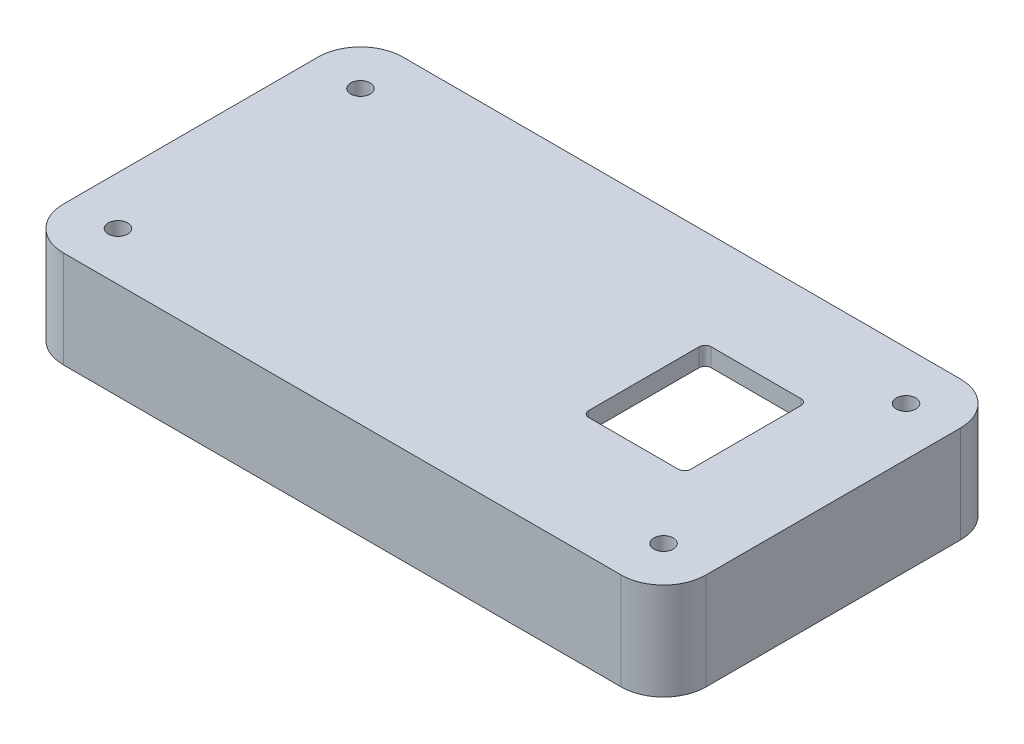
ISO-10303-21;
HEADER;
FILE_DESCRIPTION(('STEP AP214'),'2;1');
FILE_NAME('part.step','',(''),(''),'','','');
FILE_SCHEMA(('AUTOMOTIVE_DESIGN { 1 0 10303 214 1 1 1 1 }'));
ENDSEC;
DATA;
#1=APPLICATION_CONTEXT('core data for automotive mechanical design processes');
#2=APPLICATION_PROTOCOL_DEFINITION('international standard','automotive_design',2000,#1);
#3=PRODUCT_CONTEXT('',#1,'mechanical');
#4=PRODUCT('Part','Part','',(#3));
#5=PRODUCT_RELATED_PRODUCT_CATEGORY('part','',(#4));
#6=PRODUCT_DEFINITION_FORMATION('','',#4);
#7=PRODUCT_DEFINITION_CONTEXT('part definition',#1,'design');
#8=PRODUCT_DEFINITION('design','',#6,#7);
#9=PRODUCT_DEFINITION_SHAPE('','',#8);
#10=(LENGTH_UNIT() NAMED_UNIT(*) SI_UNIT(.MILLI.,.METRE.));
#11=(NAMED_UNIT(*) PLANE_ANGLE_UNIT() SI_UNIT($,.RADIAN.));
#12=(NAMED_UNIT(*) SI_UNIT($,.STERADIAN.) SOLID_ANGLE_UNIT());
#13=UNCERTAINTY_MEASURE_WITH_UNIT(LENGTH_MEASURE(1.E-05),#10,'distance_accuracy_value','');
#14=(GEOMETRIC_REPRESENTATION_CONTEXT(3) GLOBAL_UNCERTAINTY_ASSIGNED_CONTEXT((#13)) GLOBAL_UNIT_ASSIGNED_CONTEXT((#10,
#11,#12)) REPRESENTATION_CONTEXT('',''));
#15=CARTESIAN_POINT('',(0.,0.,0.));
#16=DIRECTION('',(0.,0.,1.));
#17=DIRECTION('',(1.,0.,0.));
#18=AXIS2_PLACEMENT_3D('',#15,#16,#17);
#19=CARTESIAN_POINT('',(0.,3.,0.));
#20=DIRECTION('',(0.,-1.,0.));
#21=DIRECTION('',(0.,0.,1.));
#22=AXIS2_PLACEMENT_3D('',#19,#20,#21);
#23=PLANE('',#22);
#24=CARTESIAN_POINT('',(5.00001016002,3.,-45.000088900178));
#25=DIRECTION('',(0.,-1.,0.));
#26=DIRECTION('',(0.,0.,-1.));
#27=AXIS2_PLACEMENT_3D('',#24,#25,#26);
#28=CIRCLE('',#27,3.5);
#29=CARTESIAN_POINT('',(5.00001016002,3.,-48.500088900178));
#30=VERTEX_POINT('',#29);
#31=EDGE_CURVE('E525',#30,#30,#28,.T.);
#32=ORIENTED_EDGE('',*,*,#31,.F.);
#33=EDGE_LOOP('',(#32));
#34=FACE_BOUND('',#33,.T.);
#35=CARTESIAN_POINT('',(95.000190500381,3.,-5.00001016002));
#36=DIRECTION('',(0.,-1.,0.));
#37=DIRECTION('',(0.,0.,-1.));
#38=AXIS2_PLACEMENT_3D('',#35,#36,#37);
#39=CIRCLE('',#38,3.50000000000001);
#40=CARTESIAN_POINT('',(95.000190500381,3.,-8.50001016002001));
#41=VERTEX_POINT('',#40);
#42=EDGE_CURVE('E489',#41,#41,#39,.T.);
#43=ORIENTED_EDGE('',*,*,#42,.F.);
#44=EDGE_LOOP('',(#43));
#45=FACE_BOUND('',#44,.T.);
#46=DIRECTION('',(0.,0.,1.));
#47=VECTOR('',#46,1.);
#48=CARTESIAN_POINT('',(86.627156493153,3.,0.));
#49=LINE('',#48,#47);
#50=CARTESIAN_POINT('',(86.627156493153,3.,-36.027051040815));
#51=VERTEX_POINT('',#50);
#52=CARTESIAN_POINT('',(86.627156493153,3.,-17.827051425017));
#53=VERTEX_POINT('',#52);
#54=EDGE_CURVE('E270',#51,#53,#49,.T.);
#55=ORIENTED_EDGE('',*,*,#54,.F.);
#56=CARTESIAN_POINT('',(85.627156503708,3.,-36.027051040815));
#57=DIRECTION('',(0.,-1.,0.));
#58=DIRECTION('',(0.,0.,-1.));
#59=AXIS2_PLACEMENT_3D('',#56,#57,#58);
#60=CIRCLE('',#59,0.999999989444972);
#61=CARTESIAN_POINT('',(85.627156503708,3.,-37.02705103026));
#62=VERTEX_POINT('',#61);
#63=EDGE_CURVE('E245',#51,#62,#60,.F.);
#64=ORIENTED_EDGE('',*,*,#63,.T.);
#65=DIRECTION('',(1.,0.,0.));
#66=VECTOR('',#65,1.);
#67=CARTESIAN_POINT('',(0.,3.,-37.02705103026));
#68=LINE('',#67,#66);
#69=CARTESIAN_POINT('',(70.827156816136,3.,-37.02705103026));
#70=VERTEX_POINT('',#69);
#71=EDGE_CURVE('E212',#70,#62,#68,.T.);
#72=ORIENTED_EDGE('',*,*,#71,.F.);
#73=CARTESIAN_POINT('',(70.827156816136,3.,-36.027051040815));
#74=DIRECTION('',(0.,-1.,0.));
#75=DIRECTION('',(0.,0.,-1.));
#76=AXIS2_PLACEMENT_3D('',#73,#74,#75);
#77=CIRCLE('',#76,0.999999989445003);
#78=CARTESIAN_POINT('',(69.827156826691,3.,-36.027051040815));
#79=VERTEX_POINT('',#78);
#80=EDGE_CURVE('E258',#70,#79,#77,.F.);
#81=ORIENTED_EDGE('',*,*,#80,.T.);
#82=DIRECTION('',(0.,0.,-1.));
#83=VECTOR('',#82,1.);
#84=CARTESIAN_POINT('',(69.827156826691,3.,0.));
#85=LINE('',#84,#83);
#86=CARTESIAN_POINT('',(69.827156826691,3.,-17.827051425017));
#87=VERTEX_POINT('',#86);
#88=EDGE_CURVE('E261',#87,#79,#85,.T.);
#89=ORIENTED_EDGE('',*,*,#88,.F.);
#90=CARTESIAN_POINT('',(70.827156816136,3.,-17.827051425017));
#91=DIRECTION('',(0.,-1.,0.));
#92=DIRECTION('',(0.,0.,-1.));
#93=AXIS2_PLACEMENT_3D('',#90,#91,#92);
#94=CIRCLE('',#93,0.999999989445039);
#95=CARTESIAN_POINT('',(70.827156816136,3.,-16.827051435572));
#96=VERTEX_POINT('',#95);
#97=EDGE_CURVE('E263',#96,#87,#94,.T.);
#98=ORIENTED_EDGE('',*,*,#97,.F.);
#99=DIRECTION('',(-1.,0.,0.));
#100=VECTOR('',#99,1.);
#101=CARTESIAN_POINT('',(0.,3.,-16.827051435572));
#102=LINE('',#101,#100);
#103=CARTESIAN_POINT('',(85.627156503708,3.,-16.827051435572));
#104=VERTEX_POINT('',#103);
#105=EDGE_CURVE('E265',#104,#96,#102,.T.);
#106=ORIENTED_EDGE('',*,*,#105,.F.);
#107=CARTESIAN_POINT('',(85.627156503708,3.,-17.827051425017));
#108=DIRECTION('',(0.,-1.,0.));
#109=DIRECTION('',(0.,0.,-1.));
#110=AXIS2_PLACEMENT_3D('',#107,#108,#109);
#111=CIRCLE('',#110,0.999999989445);
#112=EDGE_CURVE('E267',#104,#53,#111,.F.);
#113=ORIENTED_EDGE('',*,*,#112,.T.);
#114=EDGE_LOOP('',(#55,#64,#72,#81,#89,#98,#106,#113));
#115=FACE_BOUND('',#114,.T.);
#116=CARTESIAN_POINT('',(96.000193040386,3.,-4.00000762001506));
#117=DIRECTION('',(0.,1.,0.));
#118=DIRECTION('',(0.,0.,1.));
#119=AXIS2_PLACEMENT_3D('',#116,#117,#118);
#120=CIRCLE('',#119,5.48730759461502);
#121=CARTESIAN_POINT('',(101.487500635001,3.,-4.00000762001501));
#122=VERTEX_POINT('',#121);
#123=CARTESIAN_POINT('',(96.000193040386,3.,1.48729997459995));
#124=VERTEX_POINT('',#123);
#125=EDGE_CURVE('E352',#122,#124,#120,.F.);
#126=ORIENTED_EDGE('',*,*,#125,.T.);
#127=DIRECTION('',(1.,0.,0.));
#128=VECTOR('',#127,1.);
#129=CARTESIAN_POINT('',(0.,3.,1.48729997459995));
#130=LINE('',#129,#128);
#131=CARTESIAN_POINT('',(4.00000762001501,3.,1.48729997459995));
#132=VERTEX_POINT('',#131);
#133=EDGE_CURVE('E349',#132,#124,#130,.T.);
#134=ORIENTED_EDGE('',*,*,#133,.F.);
#135=CARTESIAN_POINT('',(4.00000762001501,3.,-4.00000762001501));
#136=DIRECTION('',(0.,1.,0.));
#137=DIRECTION('',(0.,0.,1.));
#138=AXIS2_PLACEMENT_3D('',#135,#136,#137);
#139=CIRCLE('',#138,5.48730759461496);
#140=CARTESIAN_POINT('',(-1.48729997459995,3.,-4.000007620015));
#141=VERTEX_POINT('',#140);
#142=EDGE_CURVE('E346',#132,#141,#139,.F.);
#143=ORIENTED_EDGE('',*,*,#142,.T.);
#144=DIRECTION('',(0.,0.,1.));
#145=VECTOR('',#144,1.);
#146=CARTESIAN_POINT('',(-1.48729997459995,3.,0.));
#147=LINE('',#146,#145);
#148=CARTESIAN_POINT('',(-1.48729997459995,3.,-46.000091440183));
#149=VERTEX_POINT('',#148);
#150=EDGE_CURVE('E343',#149,#141,#147,.T.);
#151=ORIENTED_EDGE('',*,*,#150,.F.);
#152=CARTESIAN_POINT('',(4.00000762001501,3.,-46.000091440183));
#153=DIRECTION('',(0.,1.,0.));
#154=DIRECTION('',(0.,0.,1.));
#155=AXIS2_PLACEMENT_3D('',#152,#153,#154);
#156=CIRCLE('',#155,5.48730759461496);
#157=CARTESIAN_POINT('',(4.00000762001501,3.,-51.487399034798));
#158=VERTEX_POINT('',#157);
#159=EDGE_CURVE('E340',#158,#149,#156,.T.);
#160=ORIENTED_EDGE('',*,*,#159,.F.);
#161=DIRECTION('',(-1.,0.,0.));
#162=VECTOR('',#161,1.);
#163=CARTESIAN_POINT('',(0.,3.,-51.487399034798));
#164=LINE('',#163,#162);
#165=CARTESIAN_POINT('',(96.000193040386,3.,-51.487399034798));
#166=VERTEX_POINT('',#165);
#167=EDGE_CURVE('E337',#166,#158,#164,.T.);
#168=ORIENTED_EDGE('',*,*,#167,.F.);
#169=CARTESIAN_POINT('',(96.000193040386,3.,-46.000091440183));
#170=DIRECTION('',(0.,1.,0.));
#171=DIRECTION('',(0.,0.,1.));
#172=AXIS2_PLACEMENT_3D('',#169,#170,#171);
#173=CIRCLE('',#172,5.48730759461502);
#174=CARTESIAN_POINT('',(101.487500635001,3.,-46.000091440183));
#175=VERTEX_POINT('',#174);
#176=EDGE_CURVE('E334',#175,#166,#173,.T.);
#177=ORIENTED_EDGE('',*,*,#176,.F.);
#178=DIRECTION('',(0.,0.,-1.));
#179=VECTOR('',#178,1.);
#180=CARTESIAN_POINT('',(101.487500635001,3.,0.));
#181=LINE('',#180,#179);
#182=EDGE_CURVE('E331',#122,#175,#181,.T.);
#183=ORIENTED_EDGE('',*,*,#182,.F.);
#184=EDGE_LOOP('',(#126,#134,#143,#151,#160,#168,#177,#183));
#185=FACE_BOUND('',#184,.T.);
#186=CARTESIAN_POINT('',(5.0000101600205,3.,-5.00001016002));
#187=DIRECTION('',(0.,-1.,0.));
#188=DIRECTION('',(0.,0.,-1.));
#189=AXIS2_PLACEMENT_3D('',#186,#187,#188);
#190=CIRCLE('',#189,3.5);
#191=CARTESIAN_POINT('',(5.0000101600205,3.,-8.50001016002));
#192=VERTEX_POINT('',#191);
#193=EDGE_CURVE('E486',#192,#192,#190,.T.);
#194=ORIENTED_EDGE('',*,*,#193,.F.);
#195=EDGE_LOOP('',(#194));
#196=FACE_BOUND('',#195,.T.);
#197=CARTESIAN_POINT('',(95.000190500381,3.,-45.000088900178));
#198=DIRECTION('',(0.,-1.,0.));
#199=DIRECTION('',(0.,0.,-1.));
#200=AXIS2_PLACEMENT_3D('',#197,#198,#199);
#201=CIRCLE('',#200,3.50000000000001);
#202=CARTESIAN_POINT('',(95.000190500381,3.,-48.500088900178));
#203=VERTEX_POINT('',#202);
#204=EDGE_CURVE('E514',#203,#203,#201,.T.);
#205=ORIENTED_EDGE('',*,*,#204,.F.);
#206=EDGE_LOOP('',(#205));
#207=FACE_BOUND('',#206,.T.);
#208=ADVANCED_FACE('F45',(#34,#45,#115,#185,#196,#207),#23,.T.);
#209=CARTESIAN_POINT('',(0.,3.,-52.987399034798));
#210=DIRECTION('',(0.,0.,1.));
#211=DIRECTION('',(1.,0.,0.));
#212=AXIS2_PLACEMENT_3D('',#209,#210,#211);
#213=PLANE('',#212);
#214=DIRECTION('',(-1.,0.,0.));
#215=VECTOR('',#214,1.);
#216=CARTESIAN_POINT('',(0.,6.,-52.987399034798));
#217=LINE('',#216,#215);
#218=CARTESIAN_POINT('',(96.000193040386,6.,-52.987399034798));
#219=VERTEX_POINT('',#218);
#220=CARTESIAN_POINT('',(4.00000762001502,6.,-52.987399034798));
#221=VERTEX_POINT('',#220);
#222=EDGE_CURVE('E355',#219,#221,#217,.T.);
#223=ORIENTED_EDGE('',*,*,#222,.F.);
#224=DIRECTION('',(0.,1.,0.));
#225=VECTOR('',#224,1.);
#226=CARTESIAN_POINT('',(96.000193040386,3.,-52.987399034798));
#227=LINE('',#226,#225);
#228=CARTESIAN_POINT('',(96.000193040386,-10.,-52.987399034798));
#229=VERTEX_POINT('',#228);
#230=EDGE_CURVE('E388',#229,#219,#227,.T.);
#231=ORIENTED_EDGE('',*,*,#230,.F.);
#232=DIRECTION('',(-1.,0.,0.));
#233=VECTOR('',#232,1.);
#234=CARTESIAN_POINT('',(0.,-10.,-52.987399034798));
#235=LINE('',#234,#233);
#236=CARTESIAN_POINT('',(4.00000762001502,-10.,-52.987399034798));
#237=VERTEX_POINT('',#236);
#238=EDGE_CURVE('E282',#229,#237,#235,.T.);
#239=ORIENTED_EDGE('',*,*,#238,.T.);
#240=DIRECTION('',(0.,1.,0.));
#241=VECTOR('',#240,1.);
#242=CARTESIAN_POINT('',(4.00000762001502,3.,-52.987399034798));
#243=LINE('',#242,#241);
#244=EDGE_CURVE('E11',#237,#221,#243,.T.);
#245=ORIENTED_EDGE('',*,*,#244,.T.);
#246=EDGE_LOOP('',(#223,#231,#239,#245));
#247=FACE_BOUND('',#246,.T.);
#248=ADVANCED_FACE('F47',(#247),#213,.F.);
#249=CARTESIAN_POINT('',(4.00000762001501,3.,-46.000091440183));
#250=DIRECTION('',(0.,1.,0.));
#251=DIRECTION('',(0.,0.,-1.));
#252=AXIS2_PLACEMENT_3D('',#249,#250,#251);
#253=CYLINDRICAL_SURFACE('',#252,6.98730759461496);
#254=CARTESIAN_POINT('',(4.00000762001501,6.,-46.000091440183));
#255=DIRECTION('',(0.,1.,0.));
#256=DIRECTION('',(0.,0.,1.));
#257=AXIS2_PLACEMENT_3D('',#254,#255,#256);
#258=CIRCLE('',#257,6.98730759461496);
#259=CARTESIAN_POINT('',(-2.98729997459995,6.,-46.000091440183));
#260=VERTEX_POINT('',#259);
#261=EDGE_CURVE('E358',#260,#221,#258,.F.);
#262=ORIENTED_EDGE('',*,*,#261,.T.);
#263=ORIENTED_EDGE('',*,*,#244,.F.);
#264=CARTESIAN_POINT('',(4.00000762001501,-10.,-46.000091440183));
#265=DIRECTION('',(0.,1.,0.));
#266=DIRECTION('',(0.,0.,1.));
#267=AXIS2_PLACEMENT_3D('',#264,#265,#266);
#268=CIRCLE('',#267,6.98730759461496);
#269=CARTESIAN_POINT('',(-2.98729997459995,-10.,-46.000091440183));
#270=VERTEX_POINT('',#269);
#271=EDGE_CURVE('E285',#270,#237,#268,.F.);
#272=ORIENTED_EDGE('',*,*,#271,.F.);
#273=DIRECTION('',(0.,1.,0.));
#274=VECTOR('',#273,1.);
#275=CARTESIAN_POINT('',(-2.98729997459995,3.,-46.000091440183));
#276=LINE('',#275,#274);
#277=EDGE_CURVE('E53',#270,#260,#276,.T.);
#278=ORIENTED_EDGE('',*,*,#277,.T.);
#279=EDGE_LOOP('',(#262,#263,#272,#278));
#280=FACE_BOUND('',#279,.T.);
#281=ADVANCED_FACE('F410',(#280),#253,.T.);
#282=CARTESIAN_POINT('',(-2.98729997459995,3.,0.));
#283=DIRECTION('',(1.,0.,0.));
#284=DIRECTION('',(0.,0.,-1.));
#285=AXIS2_PLACEMENT_3D('',#282,#283,#284);
#286=PLANE('',#285);
#287=DIRECTION('',(0.,0.,1.));
#288=VECTOR('',#287,1.);
#289=CARTESIAN_POINT('',(-2.98729997459995,6.,0.));
#290=LINE('',#289,#288);
#291=CARTESIAN_POINT('',(-2.98729997459995,6.,-4.000007620015));
#292=VERTEX_POINT('',#291);
#293=EDGE_CURVE('E360',#260,#292,#290,.T.);
#294=ORIENTED_EDGE('',*,*,#293,.F.);
#295=ORIENTED_EDGE('',*,*,#277,.F.);
#296=DIRECTION('',(0.,0.,1.));
#297=VECTOR('',#296,1.);
#298=CARTESIAN_POINT('',(-2.98729997459995,-10.,0.));
#299=LINE('',#298,#297);
#300=CARTESIAN_POINT('',(-2.98729997459995,-10.,-4.000007620015));
#301=VERTEX_POINT('',#300);
#302=EDGE_CURVE('E287',#270,#301,#299,.T.);
#303=ORIENTED_EDGE('',*,*,#302,.T.);
#304=DIRECTION('',(0.,1.,0.));
#305=VECTOR('',#304,1.);
#306=CARTESIAN_POINT('',(-2.98729997459995,3.,-4.000007620015));
#307=LINE('',#306,#305);
#308=EDGE_CURVE('E403',#301,#292,#307,.T.);
#309=ORIENTED_EDGE('',*,*,#308,.T.);
#310=EDGE_LOOP('',(#294,#295,#303,#309));
#311=FACE_BOUND('',#310,.T.);
#312=ADVANCED_FACE('F424',(#311),#286,.F.);
#313=CARTESIAN_POINT('',(4.00000762001502,3.,-4.00000762001502));
#314=DIRECTION('',(0.,1.,0.));
#315=DIRECTION('',(0.,0.,-1.));
#316=AXIS2_PLACEMENT_3D('',#313,#314,#315);
#317=CYLINDRICAL_SURFACE('',#316,6.98730759461497);
#318=CARTESIAN_POINT('',(4.00000762001502,6.,-4.00000762001502));
#319=DIRECTION('',(0.,1.,0.));
#320=DIRECTION('',(0.,0.,1.));
#321=AXIS2_PLACEMENT_3D('',#318,#319,#320);
#322=CIRCLE('',#321,6.98730759461497);
#323=CARTESIAN_POINT('',(4.00000762001502,6.,2.98729997459995));
#324=VERTEX_POINT('',#323);
#325=EDGE_CURVE('E363',#292,#324,#322,.T.);
#326=ORIENTED_EDGE('',*,*,#325,.F.);
#327=ORIENTED_EDGE('',*,*,#308,.F.);
#328=CARTESIAN_POINT('',(4.00000762001502,-10.,-4.00000762001502));
#329=DIRECTION('',(0.,1.,0.));
#330=DIRECTION('',(0.,0.,1.));
#331=AXIS2_PLACEMENT_3D('',#328,#329,#330);
#332=CIRCLE('',#331,6.98730759461497);
#333=CARTESIAN_POINT('',(4.00000762001502,-10.,2.98729997459995));
#334=VERTEX_POINT('',#333);
#335=EDGE_CURVE('E290',#301,#334,#332,.T.);
#336=ORIENTED_EDGE('',*,*,#335,.T.);
#337=DIRECTION('',(0.,1.,0.));
#338=VECTOR('',#337,1.);
#339=CARTESIAN_POINT('',(4.00000762001502,3.,2.98729997459995));
#340=LINE('',#339,#338);
#341=EDGE_CURVE('E400',#334,#324,#340,.T.);
#342=ORIENTED_EDGE('',*,*,#341,.T.);
#343=EDGE_LOOP('',(#326,#327,#336,#342));
#344=FACE_BOUND('',#343,.T.);
#345=ADVANCED_FACE('F426',(#344),#317,.T.);
#346=CARTESIAN_POINT('',(0.,3.,2.98729997459995));
#347=DIRECTION('',(0.,0.,-1.));
#348=DIRECTION('',(-1.,0.,0.));
#349=AXIS2_PLACEMENT_3D('',#346,#347,#348);
#350=PLANE('',#349);
#351=DIRECTION('',(1.,0.,0.));
#352=VECTOR('',#351,1.);
#353=CARTESIAN_POINT('',(0.,6.,2.98729997459995));
#354=LINE('',#353,#352);
#355=CARTESIAN_POINT('',(96.000193040386,6.,2.98729997459995));
#356=VERTEX_POINT('',#355);
#357=EDGE_CURVE('E366',#324,#356,#354,.T.);
#358=ORIENTED_EDGE('',*,*,#357,.F.);
#359=ORIENTED_EDGE('',*,*,#341,.F.);
#360=DIRECTION('',(1.,0.,0.));
#361=VECTOR('',#360,1.);
#362=CARTESIAN_POINT('',(0.,-10.,2.98729997459995));
#363=LINE('',#362,#361);
#364=CARTESIAN_POINT('',(96.000193040386,-10.,2.98729997459995));
#365=VERTEX_POINT('',#364);
#366=EDGE_CURVE('E272',#334,#365,#363,.T.);
#367=ORIENTED_EDGE('',*,*,#366,.T.);
#368=DIRECTION('',(0.,1.,0.));
#369=VECTOR('',#368,1.);
#370=CARTESIAN_POINT('',(96.000193040386,3.,2.98729997459995));
#371=LINE('',#370,#369);
#372=EDGE_CURVE('E397',#365,#356,#371,.T.);
#373=ORIENTED_EDGE('',*,*,#372,.T.);
#374=EDGE_LOOP('',(#358,#359,#367,#373));
#375=FACE_BOUND('',#374,.T.);
#376=ADVANCED_FACE('F429',(#375),#350,.F.);
#377=CARTESIAN_POINT('',(96.000193040386,3.,-4.00000762001507));
#378=DIRECTION('',(0.,1.,0.));
#379=DIRECTION('',(0.,0.,-1.));
#380=AXIS2_PLACEMENT_3D('',#377,#378,#379);
#381=CYLINDRICAL_SURFACE('',#380,6.98730759461502);
#382=CARTESIAN_POINT('',(96.000193040386,6.,-4.00000762001507));
#383=DIRECTION('',(0.,1.,0.));
#384=DIRECTION('',(0.,0.,1.));
#385=AXIS2_PLACEMENT_3D('',#382,#383,#384);
#386=CIRCLE('',#385,6.98730759461502);
#387=CARTESIAN_POINT('',(102.987500635001,6.,-4.00000762001502));
#388=VERTEX_POINT('',#387);
#389=EDGE_CURVE('E369',#356,#388,#386,.T.);
#390=ORIENTED_EDGE('',*,*,#389,.F.);
#391=ORIENTED_EDGE('',*,*,#372,.F.);
#392=CARTESIAN_POINT('',(96.000193040386,-10.,-4.00000762001507));
#393=DIRECTION('',(0.,1.,0.));
#394=DIRECTION('',(0.,0.,1.));
#395=AXIS2_PLACEMENT_3D('',#392,#393,#394);
#396=CIRCLE('',#395,6.98730759461502);
#397=CARTESIAN_POINT('',(102.987500635001,-10.,-4.00000762001502));
#398=VERTEX_POINT('',#397);
#399=EDGE_CURVE('E275',#365,#398,#396,.T.);
#400=ORIENTED_EDGE('',*,*,#399,.T.);
#401=DIRECTION('',(0.,1.,0.));
#402=VECTOR('',#401,1.);
#403=CARTESIAN_POINT('',(102.987500635001,3.,-4.00000762001502));
#404=LINE('',#403,#402);
#405=EDGE_CURVE('E394',#398,#388,#404,.T.);
#406=ORIENTED_EDGE('',*,*,#405,.T.);
#407=EDGE_LOOP('',(#390,#391,#400,#406));
#408=FACE_BOUND('',#407,.T.);
#409=ADVANCED_FACE('F432',(#408),#381,.T.);
#410=CARTESIAN_POINT('',(102.987500635001,3.,0.));
#411=DIRECTION('',(1.,0.,0.));
#412=DIRECTION('',(0.,0.,-1.));
#413=AXIS2_PLACEMENT_3D('',#410,#411,#412);
#414=PLANE('',#413);
#415=DIRECTION('',(0.,0.,1.));
#416=VECTOR('',#415,1.);
#417=CARTESIAN_POINT('',(102.987500635001,6.,0.));
#418=LINE('',#417,#416);
#419=CARTESIAN_POINT('',(102.987500635001,6.,-46.000091440183));
#420=VERTEX_POINT('',#419);
#421=EDGE_CURVE('E372',#420,#388,#418,.T.);
#422=ORIENTED_EDGE('',*,*,#421,.T.);
#423=ORIENTED_EDGE('',*,*,#405,.F.);
#424=DIRECTION('',(0.,0.,1.));
#425=VECTOR('',#424,1.);
#426=CARTESIAN_POINT('',(102.987500635001,-10.,0.));
#427=LINE('',#426,#425);
#428=CARTESIAN_POINT('',(102.987500635001,-10.,-46.000091440183));
#429=VERTEX_POINT('',#428);
#430=EDGE_CURVE('E278',#429,#398,#427,.T.);
#431=ORIENTED_EDGE('',*,*,#430,.F.);
#432=DIRECTION('',(0.,1.,0.));
#433=VECTOR('',#432,1.);
#434=CARTESIAN_POINT('',(102.987500635001,3.,-46.000091440183));
#435=LINE('',#434,#433);
#436=EDGE_CURVE('E391',#429,#420,#435,.T.);
#437=ORIENTED_EDGE('',*,*,#436,.T.);
#438=EDGE_LOOP('',(#422,#423,#431,#437));
#439=FACE_BOUND('',#438,.T.);
#440=ADVANCED_FACE('F436',(#439),#414,.T.);
#441=CARTESIAN_POINT('',(95.000190500381,3.,-45.000088900178));
#442=DIRECTION('',(0.,1.,0.));
#443=DIRECTION('',(0.,0.,-1.));
#444=AXIS2_PLACEMENT_3D('',#441,#442,#443);
#445=CYLINDRICAL_SURFACE('',#444,1.600003175006);
#446=CARTESIAN_POINT('',(95.000190500381,6.,-45.000088900178));
#447=DIRECTION('',(0.,1.,0.));
#448=DIRECTION('',(0.,0.,1.));
#449=AXIS2_PLACEMENT_3D('',#446,#447,#448);
#450=CIRCLE('',#449,1.600003175006);
#451=CARTESIAN_POINT('',(95.000190500381,6.,-43.400085725172));
#452=VERTEX_POINT('',#451);
#453=EDGE_CURVE('E385',#452,#452,#450,.T.);
#454=ORIENTED_EDGE('',*,*,#453,.T.);
#455=EDGE_LOOP('',(#454));
#456=FACE_BOUND('',#455,.T.);
#457=CARTESIAN_POINT('',(95.000190500381,-6.5,-45.000088900178));
#458=DIRECTION('',(0.,-1.,0.));
#459=DIRECTION('',(0.,0.,-1.));
#460=AXIS2_PLACEMENT_3D('',#457,#458,#459);
#461=CIRCLE('',#460,1.600003175006);
#462=CARTESIAN_POINT('',(95.000190500381,-6.5,-46.600092075184));
#463=VERTEX_POINT('',#462);
#464=EDGE_CURVE('E516',#463,#463,#461,.T.);
#465=ORIENTED_EDGE('',*,*,#464,.T.);
#466=EDGE_LOOP('',(#465));
#467=FACE_BOUND('',#466,.T.);
#468=ADVANCED_FACE('F467',(#456,#467),#445,.F.);
#469=CARTESIAN_POINT('',(95.000190500381,3.,-5.00001016002));
#470=DIRECTION('',(0.,1.,0.));
#471=DIRECTION('',(0.,0.,-1.));
#472=AXIS2_PLACEMENT_3D('',#469,#470,#471);
#473=CYLINDRICAL_SURFACE('',#472,1.600003175006);
#474=CARTESIAN_POINT('',(95.000190500381,6.,-5.00001016002));
#475=DIRECTION('',(0.,1.,0.));
#476=DIRECTION('',(0.,0.,1.));
#477=AXIS2_PLACEMENT_3D('',#474,#475,#476);
#478=CIRCLE('',#477,1.600003175006);
#479=CARTESIAN_POINT('',(95.000190500381,6.,-3.400006985014));
#480=VERTEX_POINT('',#479);
#481=EDGE_CURVE('E382',#480,#480,#478,.T.);
#482=ORIENTED_EDGE('',*,*,#481,.T.);
#483=EDGE_LOOP('',(#482));
#484=FACE_BOUND('',#483,.T.);
#485=CARTESIAN_POINT('',(95.000190500381,-6.5,-5.00001016002));
#486=DIRECTION('',(0.,-1.,0.));
#487=DIRECTION('',(0.,0.,-1.));
#488=AXIS2_PLACEMENT_3D('',#485,#486,#487);
#489=CIRCLE('',#488,1.600003175006);
#490=CARTESIAN_POINT('',(95.000190500381,-6.5,-6.600013335026));
#491=VERTEX_POINT('',#490);
#492=EDGE_CURVE('E485',#491,#491,#489,.T.);
#493=ORIENTED_EDGE('',*,*,#492,.T.);
#494=EDGE_LOOP('',(#493));
#495=FACE_BOUND('',#494,.T.);
#496=ADVANCED_FACE('F470',(#484,#495),#473,.F.);
#497=CARTESIAN_POINT('',(5.0000101600205,3.,-5.00001016002));
#498=DIRECTION('',(0.,1.,0.));
#499=DIRECTION('',(0.,0.,-1.));
#500=AXIS2_PLACEMENT_3D('',#497,#498,#499);
#501=CYLINDRICAL_SURFACE('',#500,1.6000031750065);
#502=CARTESIAN_POINT('',(5.0000101600205,6.,-5.00001016002));
#503=DIRECTION('',(0.,1.,0.));
#504=DIRECTION('',(0.,0.,1.));
#505=AXIS2_PLACEMENT_3D('',#502,#503,#504);
#506=CIRCLE('',#505,1.6000031750065);
#507=CARTESIAN_POINT('',(5.0000101600205,6.,-3.4000069850135));
#508=VERTEX_POINT('',#507);
#509=EDGE_CURVE('E379',#508,#508,#506,.T.);
#510=ORIENTED_EDGE('',*,*,#509,.T.);
#511=EDGE_LOOP('',(#510));
#512=FACE_BOUND('',#511,.T.);
#513=CARTESIAN_POINT('',(5.0000101600205,-6.5,-5.00001016002));
#514=DIRECTION('',(0.,-1.,0.));
#515=DIRECTION('',(0.,0.,-1.));
#516=AXIS2_PLACEMENT_3D('',#513,#514,#515);
#517=CIRCLE('',#516,1.6000031750065);
#518=CARTESIAN_POINT('',(5.0000101600205,-6.5,-6.6000133350265));
#519=VERTEX_POINT('',#518);
#520=EDGE_CURVE('E483',#519,#519,#517,.T.);
#521=ORIENTED_EDGE('',*,*,#520,.T.);
#522=EDGE_LOOP('',(#521));
#523=FACE_BOUND('',#522,.T.);
#524=ADVANCED_FACE('F450',(#512,#523),#501,.F.);
#525=CARTESIAN_POINT('',(5.00001016002,3.,-45.000088900178));
#526=DIRECTION('',(0.,1.,0.));
#527=DIRECTION('',(0.,0.,-1.));
#528=AXIS2_PLACEMENT_3D('',#525,#526,#527);
#529=CYLINDRICAL_SURFACE('',#528,1.6000031750065);
#530=CARTESIAN_POINT('',(5.00001016002,6.,-45.000088900178));
#531=DIRECTION('',(0.,1.,0.));
#532=DIRECTION('',(0.,0.,1.));
#533=AXIS2_PLACEMENT_3D('',#530,#531,#532);
#534=CIRCLE('',#533,1.6000031750065);
#535=CARTESIAN_POINT('',(5.00001016002,6.,-43.4000857251715));
#536=VERTEX_POINT('',#535);
#537=EDGE_CURVE('E376',#536,#536,#534,.T.);
#538=ORIENTED_EDGE('',*,*,#537,.T.);
#539=EDGE_LOOP('',(#538));
#540=FACE_BOUND('',#539,.T.);
#541=CARTESIAN_POINT('',(5.00001016002,-6.5,-45.000088900178));
#542=DIRECTION('',(0.,-1.,0.));
#543=DIRECTION('',(0.,0.,-1.));
#544=AXIS2_PLACEMENT_3D('',#541,#542,#543);
#545=CIRCLE('',#544,1.6000031750065);
#546=CARTESIAN_POINT('',(5.00001016002,-6.5,-46.6000920751845));
#547=VERTEX_POINT('',#546);
#548=EDGE_CURVE('E528',#547,#547,#545,.T.);
#549=ORIENTED_EDGE('',*,*,#548,.T.);
#550=EDGE_LOOP('',(#549));
#551=FACE_BOUND('',#550,.T.);
#552=ADVANCED_FACE('F440',(#540,#551),#529,.F.);
#553=CARTESIAN_POINT('',(96.000193040386,3.,-46.000091440183));
#554=DIRECTION('',(0.,1.,0.));
#555=DIRECTION('',(0.,0.,-1.));
#556=AXIS2_PLACEMENT_3D('',#553,#554,#555);
#557=CYLINDRICAL_SURFACE('',#556,6.987307594615);
#558=CARTESIAN_POINT('',(96.000193040386,6.,-46.000091440183));
#559=DIRECTION('',(0.,1.,0.));
#560=DIRECTION('',(0.,0.,1.));
#561=AXIS2_PLACEMENT_3D('',#558,#559,#560);
#562=CIRCLE('',#561,6.987307594615);
#563=EDGE_CURVE('E374',#219,#420,#562,.F.);
#564=ORIENTED_EDGE('',*,*,#563,.T.);
#565=ORIENTED_EDGE('',*,*,#436,.F.);
#566=CARTESIAN_POINT('',(96.000193040386,-10.,-46.000091440183));
#567=DIRECTION('',(0.,1.,0.));
#568=DIRECTION('',(0.,0.,1.));
#569=AXIS2_PLACEMENT_3D('',#566,#567,#568);
#570=CIRCLE('',#569,6.987307594615);
#571=EDGE_CURVE('E280',#229,#429,#570,.F.);
#572=ORIENTED_EDGE('',*,*,#571,.F.);
#573=ORIENTED_EDGE('',*,*,#230,.T.);
#574=EDGE_LOOP('',(#564,#565,#572,#573));
#575=FACE_BOUND('',#574,.T.);
#576=ADVANCED_FACE('F438',(#575),#557,.T.);
#577=CARTESIAN_POINT('',(0.,6.,0.));
#578=DIRECTION('',(0.,-1.,0.));
#579=DIRECTION('',(0.,0.,1.));
#580=AXIS2_PLACEMENT_3D('',#577,#578,#579);
#581=PLANE('',#580);
#582=CARTESIAN_POINT('',(85.627156503708,6.,-36.027051040815));
#583=DIRECTION('',(0.,1.,0.));
#584=DIRECTION('',(0.,0.,1.));
#585=AXIS2_PLACEMENT_3D('',#582,#583,#584);
#586=CIRCLE('',#585,0.999999989444972);
#587=CARTESIAN_POINT('',(85.627156503708,6.,-37.02705103026));
#588=VERTEX_POINT('',#587);
#589=CARTESIAN_POINT('',(86.627156493153,6.,-36.027051040815));
#590=VERTEX_POINT('',#589);
#591=EDGE_CURVE('E218',#588,#590,#586,.F.);
#592=ORIENTED_EDGE('',*,*,#591,.T.);
#593=DIRECTION('',(0.,0.,-1.));
#594=VECTOR('',#593,1.);
#595=CARTESIAN_POINT('',(86.627156493153,6.,0.));
#596=LINE('',#595,#594);
#597=CARTESIAN_POINT('',(86.627156493153,6.,-17.827051425017));
#598=VERTEX_POINT('',#597);
#599=EDGE_CURVE('E68',#598,#590,#596,.T.);
#600=ORIENTED_EDGE('',*,*,#599,.F.);
#601=CARTESIAN_POINT('',(85.627156503708,6.,-17.827051425017));
#602=DIRECTION('',(0.,1.,0.));
#603=DIRECTION('',(0.,0.,1.));
#604=AXIS2_PLACEMENT_3D('',#601,#602,#603);
#605=CIRCLE('',#604,0.999999989445);
#606=CARTESIAN_POINT('',(85.627156503708,6.,-16.827051435572));
#607=VERTEX_POINT('',#606);
#608=EDGE_CURVE('E240',#598,#607,#605,.F.);
#609=ORIENTED_EDGE('',*,*,#608,.T.);
#610=DIRECTION('',(1.,0.,0.));
#611=VECTOR('',#610,1.);
#612=CARTESIAN_POINT('',(0.,6.,-16.827051435572));
#613=LINE('',#612,#611);
#614=CARTESIAN_POINT('',(70.827156816136,6.,-16.827051435572));
#615=VERTEX_POINT('',#614);
#616=EDGE_CURVE('E237',#615,#607,#613,.T.);
#617=ORIENTED_EDGE('',*,*,#616,.F.);
#618=CARTESIAN_POINT('',(70.827156816136,6.,-17.827051425017));
#619=DIRECTION('',(0.,1.,0.));
#620=DIRECTION('',(0.,0.,1.));
#621=AXIS2_PLACEMENT_3D('',#618,#619,#620);
#622=CIRCLE('',#621,0.999999989445039);
#623=CARTESIAN_POINT('',(69.827156826691,6.,-17.827051425017));
#624=VERTEX_POINT('',#623);
#625=EDGE_CURVE('E234',#624,#615,#622,.T.);
#626=ORIENTED_EDGE('',*,*,#625,.F.);
#627=DIRECTION('',(0.,0.,1.));
#628=VECTOR('',#627,1.);
#629=CARTESIAN_POINT('',(69.827156826691,6.,0.));
#630=LINE('',#629,#628);
#631=CARTESIAN_POINT('',(69.827156826691,6.,-36.027051040815));
#632=VERTEX_POINT('',#631);
#633=EDGE_CURVE('E228',#632,#624,#630,.T.);
#634=ORIENTED_EDGE('',*,*,#633,.F.);
#635=CARTESIAN_POINT('',(70.827156816136,6.,-36.027051040815));
#636=DIRECTION('',(0.,1.,0.));
#637=DIRECTION('',(0.,0.,1.));
#638=AXIS2_PLACEMENT_3D('',#635,#636,#637);
#639=CIRCLE('',#638,0.999999989445003);
#640=CARTESIAN_POINT('',(70.827156816136,6.,-37.02705103026));
#641=VERTEX_POINT('',#640);
#642=EDGE_CURVE('E226',#632,#641,#639,.F.);
#643=ORIENTED_EDGE('',*,*,#642,.T.);
#644=DIRECTION('',(-1.,0.,0.));
#645=VECTOR('',#644,1.);
#646=CARTESIAN_POINT('',(0.,6.,-37.02705103026));
#647=LINE('',#646,#645);
#648=EDGE_CURVE('E209',#588,#641,#647,.T.);
#649=ORIENTED_EDGE('',*,*,#648,.F.);
#650=EDGE_LOOP('',(#592,#600,#609,#617,#626,#634,#643,#649));
#651=FACE_BOUND('',#650,.T.);
#652=ORIENTED_EDGE('',*,*,#537,.F.);
#653=EDGE_LOOP('',(#652));
#654=FACE_BOUND('',#653,.T.);
#655=ORIENTED_EDGE('',*,*,#509,.F.);
#656=EDGE_LOOP('',(#655));
#657=FACE_BOUND('',#656,.T.);
#658=ORIENTED_EDGE('',*,*,#481,.F.);
#659=EDGE_LOOP('',(#658));
#660=FACE_BOUND('',#659,.T.);
#661=ORIENTED_EDGE('',*,*,#453,.F.);
#662=EDGE_LOOP('',(#661));
#663=FACE_BOUND('',#662,.T.);
#664=ORIENTED_EDGE('',*,*,#222,.T.);
#665=ORIENTED_EDGE('',*,*,#261,.F.);
#666=ORIENTED_EDGE('',*,*,#293,.T.);
#667=ORIENTED_EDGE('',*,*,#325,.T.);
#668=ORIENTED_EDGE('',*,*,#357,.T.);
#669=ORIENTED_EDGE('',*,*,#389,.T.);
#670=ORIENTED_EDGE('',*,*,#421,.F.);
#671=ORIENTED_EDGE('',*,*,#563,.F.);
#672=EDGE_LOOP('',(#664,#665,#666,#667,#668,#669,#670,#671));
#673=FACE_BOUND('',#672,.T.);
#674=ADVANCED_FACE('F222',(#651,#654,#657,#660,#663,#673),#581,.F.);
#675=CARTESIAN_POINT('',(96.000193040386,-10.,-4.00000762001506));
#676=DIRECTION('',(0.,1.,0.));
#677=DIRECTION('',(0.,0.,-1.));
#678=AXIS2_PLACEMENT_3D('',#675,#676,#677);
#679=CYLINDRICAL_SURFACE('',#678,5.48730759461502);
#680=DIRECTION('',(0.,1.,0.));
#681=VECTOR('',#680,1.);
#682=CARTESIAN_POINT('',(101.487500635001,-10.,-4.00000762001501));
#683=LINE('',#682,#681);
#684=CARTESIAN_POINT('',(101.487500635001,-10.,-4.00000762001501));
#685=VERTEX_POINT('',#684);
#686=EDGE_CURVE('E315',#685,#122,#683,.T.);
#687=ORIENTED_EDGE('',*,*,#686,.F.);
#688=CARTESIAN_POINT('',(96.000193040386,-10.,-4.00000762001506));
#689=DIRECTION('',(0.,1.,0.));
#690=DIRECTION('',(0.,0.,1.));
#691=AXIS2_PLACEMENT_3D('',#688,#689,#690);
#692=CIRCLE('',#691,5.48730759461502);
#693=CARTESIAN_POINT('',(96.000193040386,-10.,1.48729997459995));
#694=VERTEX_POINT('',#693);
#695=EDGE_CURVE('E293',#694,#685,#692,.T.);
#696=ORIENTED_EDGE('',*,*,#695,.F.);
#697=DIRECTION('',(0.,1.,0.));
#698=VECTOR('',#697,1.);
#699=CARTESIAN_POINT('',(96.000193040386,-10.,1.48729997459995));
#700=LINE('',#699,#698);
#701=EDGE_CURVE('E329',#694,#124,#700,.T.);
#702=ORIENTED_EDGE('',*,*,#701,.T.);
#703=ORIENTED_EDGE('',*,*,#125,.F.);
#704=EDGE_LOOP('',(#687,#696,#702,#703));
#705=FACE_BOUND('',#704,.T.);
#706=ADVANCED_FACE('F447',(#705),#679,.F.);
#707=CARTESIAN_POINT('',(0.,-10.,1.48729997459995));
#708=DIRECTION('',(0.,0.,1.));
#709=DIRECTION('',(1.,0.,0.));
#710=AXIS2_PLACEMENT_3D('',#707,#708,#709);
#711=PLANE('',#710);
#712=ORIENTED_EDGE('',*,*,#133,.T.);
#713=ORIENTED_EDGE('',*,*,#701,.F.);
#714=DIRECTION('',(-1.,0.,0.));
#715=VECTOR('',#714,1.);
#716=CARTESIAN_POINT('',(0.,-10.,1.48729997459995));
#717=LINE('',#716,#715);
#718=CARTESIAN_POINT('',(4.00000762001501,-10.,1.48729997459995));
#719=VERTEX_POINT('',#718);
#720=EDGE_CURVE('E296',#694,#719,#717,.T.);
#721=ORIENTED_EDGE('',*,*,#720,.T.);
#722=DIRECTION('',(0.,1.,0.));
#723=VECTOR('',#722,1.);
#724=CARTESIAN_POINT('',(4.00000762001501,-10.,1.48729997459995));
#725=LINE('',#724,#723);
#726=EDGE_CURVE('E327',#719,#132,#725,.T.);
#727=ORIENTED_EDGE('',*,*,#726,.T.);
#728=EDGE_LOOP('',(#712,#713,#721,#727));
#729=FACE_BOUND('',#728,.T.);
#730=ADVANCED_FACE('F612',(#729),#711,.F.);
#731=CARTESIAN_POINT('',(4.00000762001501,-10.,-4.00000762001501));
#732=DIRECTION('',(0.,1.,0.));
#733=DIRECTION('',(0.,0.,-1.));
#734=AXIS2_PLACEMENT_3D('',#731,#732,#733);
#735=CYLINDRICAL_SURFACE('',#734,5.48730759461496);
#736=ORIENTED_EDGE('',*,*,#726,.F.);
#737=CARTESIAN_POINT('',(4.00000762001501,-10.,-4.00000762001501));
#738=DIRECTION('',(0.,1.,0.));
#739=DIRECTION('',(0.,0.,1.));
#740=AXIS2_PLACEMENT_3D('',#737,#738,#739);
#741=CIRCLE('',#740,5.48730759461496);
#742=CARTESIAN_POINT('',(-1.48729997459995,-10.,-4.000007620015));
#743=VERTEX_POINT('',#742);
#744=EDGE_CURVE('E299',#743,#719,#741,.T.);
#745=ORIENTED_EDGE('',*,*,#744,.F.);
#746=DIRECTION('',(0.,1.,0.));
#747=VECTOR('',#746,1.);
#748=CARTESIAN_POINT('',(-1.48729997459995,-10.,-4.000007620015));
#749=LINE('',#748,#747);
#750=EDGE_CURVE('E325',#743,#141,#749,.T.);
#751=ORIENTED_EDGE('',*,*,#750,.T.);
#752=ORIENTED_EDGE('',*,*,#142,.F.);
#753=EDGE_LOOP('',(#736,#745,#751,#752));
#754=FACE_BOUND('',#753,.T.);
#755=ADVANCED_FACE('F609',(#754),#735,.F.);
#756=CARTESIAN_POINT('',(-1.48729997459995,-10.,0.));
#757=DIRECTION('',(-1.,0.,0.));
#758=DIRECTION('',(0.,0.,1.));
#759=AXIS2_PLACEMENT_3D('',#756,#757,#758);
#760=PLANE('',#759);
#761=ORIENTED_EDGE('',*,*,#150,.T.);
#762=ORIENTED_EDGE('',*,*,#750,.F.);
#763=DIRECTION('',(0.,0.,-1.));
#764=VECTOR('',#763,1.);
#765=CARTESIAN_POINT('',(-1.48729997459995,-10.,0.));
#766=LINE('',#765,#764);
#767=CARTESIAN_POINT('',(-1.48729997459995,-10.,-46.000091440183));
#768=VERTEX_POINT('',#767);
#769=EDGE_CURVE('E301',#743,#768,#766,.T.);
#770=ORIENTED_EDGE('',*,*,#769,.T.);
#771=DIRECTION('',(0.,1.,0.));
#772=VECTOR('',#771,1.);
#773=CARTESIAN_POINT('',(-1.48729997459995,-10.,-46.000091440183));
#774=LINE('',#773,#772);
#775=EDGE_CURVE('E323',#768,#149,#774,.T.);
#776=ORIENTED_EDGE('',*,*,#775,.T.);
#777=EDGE_LOOP('',(#761,#762,#770,#776));
#778=FACE_BOUND('',#777,.T.);
#779=ADVANCED_FACE('F605',(#778),#760,.F.);
#780=CARTESIAN_POINT('',(4.00000762001501,-10.,-46.000091440183));
#781=DIRECTION('',(0.,1.,0.));
#782=DIRECTION('',(0.,0.,-1.));
#783=AXIS2_PLACEMENT_3D('',#780,#781,#782);
#784=CYLINDRICAL_SURFACE('',#783,5.48730759461496);
#785=ORIENTED_EDGE('',*,*,#159,.T.);
#786=ORIENTED_EDGE('',*,*,#775,.F.);
#787=CARTESIAN_POINT('',(4.00000762001501,-10.,-46.000091440183));
#788=DIRECTION('',(0.,1.,0.));
#789=DIRECTION('',(0.,0.,1.));
#790=AXIS2_PLACEMENT_3D('',#787,#788,#789);
#791=CIRCLE('',#790,5.48730759461496);
#792=CARTESIAN_POINT('',(4.00000762001501,-10.,-51.487399034798));
#793=VERTEX_POINT('',#792);
#794=EDGE_CURVE('E304',#768,#793,#791,.F.);
#795=ORIENTED_EDGE('',*,*,#794,.T.);
#796=DIRECTION('',(0.,1.,0.));
#797=VECTOR('',#796,1.);
#798=CARTESIAN_POINT('',(4.00000762001501,-10.,-51.487399034798));
#799=LINE('',#798,#797);
#800=EDGE_CURVE('E321',#793,#158,#799,.T.);
#801=ORIENTED_EDGE('',*,*,#800,.T.);
#802=EDGE_LOOP('',(#785,#786,#795,#801));
#803=FACE_BOUND('',#802,.T.);
#804=ADVANCED_FACE('F601',(#803),#784,.F.);
#805=CARTESIAN_POINT('',(0.,-10.,-51.487399034798));
#806=DIRECTION('',(0.,0.,-1.));
#807=DIRECTION('',(-1.,0.,0.));
#808=AXIS2_PLACEMENT_3D('',#805,#806,#807);
#809=PLANE('',#808);
#810=ORIENTED_EDGE('',*,*,#167,.T.);
#811=ORIENTED_EDGE('',*,*,#800,.F.);
#812=DIRECTION('',(1.,0.,0.));
#813=VECTOR('',#812,1.);
#814=CARTESIAN_POINT('',(0.,-10.,-51.487399034798));
#815=LINE('',#814,#813);
#816=CARTESIAN_POINT('',(96.000193040386,-10.,-51.487399034798));
#817=VERTEX_POINT('',#816);
#818=EDGE_CURVE('E307',#793,#817,#815,.T.);
#819=ORIENTED_EDGE('',*,*,#818,.T.);
#820=DIRECTION('',(0.,1.,0.));
#821=VECTOR('',#820,1.);
#822=CARTESIAN_POINT('',(96.000193040386,-10.,-51.487399034798));
#823=LINE('',#822,#821);
#824=EDGE_CURVE('E319',#817,#166,#823,.T.);
#825=ORIENTED_EDGE('',*,*,#824,.T.);
#826=EDGE_LOOP('',(#810,#811,#819,#825));
#827=FACE_BOUND('',#826,.T.);
#828=ADVANCED_FACE('F597',(#827),#809,.F.);
#829=CARTESIAN_POINT('',(96.000193040386,-10.,-46.000091440183));
#830=DIRECTION('',(0.,1.,0.));
#831=DIRECTION('',(0.,0.,-1.));
#832=AXIS2_PLACEMENT_3D('',#829,#830,#831);
#833=CYLINDRICAL_SURFACE('',#832,5.48730759461502);
#834=ORIENTED_EDGE('',*,*,#176,.T.);
#835=ORIENTED_EDGE('',*,*,#824,.F.);
#836=CARTESIAN_POINT('',(96.000193040386,-10.,-46.000091440183));
#837=DIRECTION('',(0.,1.,0.));
#838=DIRECTION('',(0.,0.,1.));
#839=AXIS2_PLACEMENT_3D('',#836,#837,#838);
#840=CIRCLE('',#839,5.48730759461502);
#841=CARTESIAN_POINT('',(101.487500635001,-10.,-46.000091440183));
#842=VERTEX_POINT('',#841);
#843=EDGE_CURVE('E310',#817,#842,#840,.F.);
#844=ORIENTED_EDGE('',*,*,#843,.T.);
#845=DIRECTION('',(0.,1.,0.));
#846=VECTOR('',#845,1.);
#847=CARTESIAN_POINT('',(101.487500635001,-10.,-46.000091440183));
#848=LINE('',#847,#846);
#849=EDGE_CURVE('E317',#842,#175,#848,.T.);
#850=ORIENTED_EDGE('',*,*,#849,.T.);
#851=EDGE_LOOP('',(#834,#835,#844,#850));
#852=FACE_BOUND('',#851,.T.);
#853=ADVANCED_FACE('F593',(#852),#833,.F.);
#854=CARTESIAN_POINT('',(101.487500635001,-10.,0.));
#855=DIRECTION('',(1.,0.,0.));
#856=DIRECTION('',(0.,0.,-1.));
#857=AXIS2_PLACEMENT_3D('',#854,#855,#856);
#858=PLANE('',#857);
#859=ORIENTED_EDGE('',*,*,#182,.T.);
#860=ORIENTED_EDGE('',*,*,#849,.F.);
#861=DIRECTION('',(0.,0.,1.));
#862=VECTOR('',#861,1.);
#863=CARTESIAN_POINT('',(101.487500635001,-10.,0.));
#864=LINE('',#863,#862);
#865=EDGE_CURVE('E313',#842,#685,#864,.T.);
#866=ORIENTED_EDGE('',*,*,#865,.T.);
#867=ORIENTED_EDGE('',*,*,#686,.T.);
#868=EDGE_LOOP('',(#859,#860,#866,#867));
#869=FACE_BOUND('',#868,.T.);
#870=ADVANCED_FACE('F590',(#869),#858,.F.);
#871=CARTESIAN_POINT('',(0.,-10.,0.));
#872=DIRECTION('',(0.,-1.,0.));
#873=DIRECTION('',(0.,0.,1.));
#874=AXIS2_PLACEMENT_3D('',#871,#872,#873);
#875=PLANE('',#874);
#876=ORIENTED_EDGE('',*,*,#366,.F.);
#877=ORIENTED_EDGE('',*,*,#335,.F.);
#878=ORIENTED_EDGE('',*,*,#302,.F.);
#879=ORIENTED_EDGE('',*,*,#271,.T.);
#880=ORIENTED_EDGE('',*,*,#238,.F.);
#881=ORIENTED_EDGE('',*,*,#571,.T.);
#882=ORIENTED_EDGE('',*,*,#430,.T.);
#883=ORIENTED_EDGE('',*,*,#399,.F.);
#884=EDGE_LOOP('',(#876,#877,#878,#879,#880,#881,#882,#883));
#885=FACE_BOUND('',#884,.T.);
#886=ORIENTED_EDGE('',*,*,#695,.T.);
#887=ORIENTED_EDGE('',*,*,#865,.F.);
#888=ORIENTED_EDGE('',*,*,#843,.F.);
#889=ORIENTED_EDGE('',*,*,#818,.F.);
#890=ORIENTED_EDGE('',*,*,#794,.F.);
#891=ORIENTED_EDGE('',*,*,#769,.F.);
#892=ORIENTED_EDGE('',*,*,#744,.T.);
#893=ORIENTED_EDGE('',*,*,#720,.F.);
#894=EDGE_LOOP('',(#886,#887,#888,#889,#890,#891,#892,#893));
#895=FACE_BOUND('',#894,.T.);
#896=ADVANCED_FACE('F420',(#885,#895),#875,.T.);
#897=CARTESIAN_POINT('',(86.627156493153,-4.,0.));
#898=DIRECTION('',(1.,0.,0.));
#899=DIRECTION('',(0.,0.,-1.));
#900=AXIS2_PLACEMENT_3D('',#897,#898,#899);
#901=PLANE('',#900);
#902=ORIENTED_EDGE('',*,*,#54,.T.);
#903=DIRECTION('',(0.,1.,0.));
#904=VECTOR('',#903,1.);
#905=CARTESIAN_POINT('',(86.627156493153,-4.,-17.827051425017));
#906=LINE('',#905,#904);
#907=EDGE_CURVE('E243',#53,#598,#906,.T.);
#908=ORIENTED_EDGE('',*,*,#907,.T.);
#909=ORIENTED_EDGE('',*,*,#599,.T.);
#910=DIRECTION('',(0.,1.,0.));
#911=VECTOR('',#910,1.);
#912=CARTESIAN_POINT('',(86.627156493153,-4.,-36.027051040815));
#913=LINE('',#912,#911);
#914=EDGE_CURVE('E215',#51,#590,#913,.T.);
#915=ORIENTED_EDGE('',*,*,#914,.F.);
#916=EDGE_LOOP('',(#902,#908,#909,#915));
#917=FACE_BOUND('',#916,.T.);
#918=ADVANCED_FACE('F565',(#917),#901,.F.);
#919=CARTESIAN_POINT('',(85.627156503708,-4.,-17.827051425017));
#920=DIRECTION('',(0.,1.,0.));
#921=DIRECTION('',(0.,0.,1.));
#922=AXIS2_PLACEMENT_3D('',#919,#920,#921);
#923=CYLINDRICAL_SURFACE('',#922,0.999999989445);
#924=DIRECTION('',(0.,1.,0.));
#925=VECTOR('',#924,1.);
#926=CARTESIAN_POINT('',(85.627156503708,-4.,-16.827051435572));
#927=LINE('',#926,#925);
#928=EDGE_CURVE('E246',#104,#607,#927,.T.);
#929=ORIENTED_EDGE('',*,*,#928,.T.);
#930=ORIENTED_EDGE('',*,*,#608,.F.);
#931=ORIENTED_EDGE('',*,*,#907,.F.);
#932=ORIENTED_EDGE('',*,*,#112,.F.);
#933=EDGE_LOOP('',(#929,#930,#931,#932));
#934=FACE_BOUND('',#933,.T.);
#935=ADVANCED_FACE('F561',(#934),#923,.F.);
#936=CARTESIAN_POINT('',(0.,-4.,-16.827051435572));
#937=DIRECTION('',(0.,0.,1.));
#938=DIRECTION('',(1.,0.,0.));
#939=AXIS2_PLACEMENT_3D('',#936,#937,#938);
#940=PLANE('',#939);
#941=ORIENTED_EDGE('',*,*,#105,.T.);
#942=DIRECTION('',(0.,1.,0.));
#943=VECTOR('',#942,1.);
#944=CARTESIAN_POINT('',(70.827156816136,-4.,-16.827051435572));
#945=LINE('',#944,#943);
#946=EDGE_CURVE('E248',#96,#615,#945,.T.);
#947=ORIENTED_EDGE('',*,*,#946,.T.);
#948=ORIENTED_EDGE('',*,*,#616,.T.);
#949=ORIENTED_EDGE('',*,*,#928,.F.);
#950=EDGE_LOOP('',(#941,#947,#948,#949));
#951=FACE_BOUND('',#950,.T.);
#952=ADVANCED_FACE('F564',(#951),#940,.F.);
#953=CARTESIAN_POINT('',(70.827156816136,-4.,-17.827051425017));
#954=DIRECTION('',(0.,1.,0.));
#955=DIRECTION('',(0.,0.,1.));
#956=AXIS2_PLACEMENT_3D('',#953,#954,#955);
#957=CYLINDRICAL_SURFACE('',#956,0.999999989445039);
#958=ORIENTED_EDGE('',*,*,#97,.T.);
#959=DIRECTION('',(0.,1.,0.));
#960=VECTOR('',#959,1.);
#961=CARTESIAN_POINT('',(69.827156826691,-4.,-17.827051425017));
#962=LINE('',#961,#960);
#963=EDGE_CURVE('E250',#87,#624,#962,.T.);
#964=ORIENTED_EDGE('',*,*,#963,.T.);
#965=ORIENTED_EDGE('',*,*,#625,.T.);
#966=ORIENTED_EDGE('',*,*,#946,.F.);
#967=EDGE_LOOP('',(#958,#964,#965,#966));
#968=FACE_BOUND('',#967,.T.);
#969=ADVANCED_FACE('F569',(#968),#957,.F.);
#970=CARTESIAN_POINT('',(69.827156826691,-4.,0.));
#971=DIRECTION('',(-1.,0.,0.));
#972=DIRECTION('',(0.,0.,1.));
#973=AXIS2_PLACEMENT_3D('',#970,#971,#972);
#974=PLANE('',#973);
#975=ORIENTED_EDGE('',*,*,#88,.T.);
#976=DIRECTION('',(0.,1.,0.));
#977=VECTOR('',#976,1.);
#978=CARTESIAN_POINT('',(69.827156826691,-4.,-36.027051040815));
#979=LINE('',#978,#977);
#980=EDGE_CURVE('E252',#79,#632,#979,.T.);
#981=ORIENTED_EDGE('',*,*,#980,.T.);
#982=ORIENTED_EDGE('',*,*,#633,.T.);
#983=ORIENTED_EDGE('',*,*,#963,.F.);
#984=EDGE_LOOP('',(#975,#981,#982,#983));
#985=FACE_BOUND('',#984,.T.);
#986=ADVANCED_FACE('F573',(#985),#974,.F.);
#987=CARTESIAN_POINT('',(70.827156816136,-4.,-36.027051040815));
#988=DIRECTION('',(0.,1.,0.));
#989=DIRECTION('',(0.,0.,1.));
#990=AXIS2_PLACEMENT_3D('',#987,#988,#989);
#991=CYLINDRICAL_SURFACE('',#990,0.999999989445003);
#992=DIRECTION('',(0.,1.,0.));
#993=VECTOR('',#992,1.);
#994=CARTESIAN_POINT('',(70.827156816136,-4.,-37.02705103026));
#995=LINE('',#994,#993);
#996=EDGE_CURVE('E214',#70,#641,#995,.T.);
#997=ORIENTED_EDGE('',*,*,#996,.T.);
#998=ORIENTED_EDGE('',*,*,#642,.F.);
#999=ORIENTED_EDGE('',*,*,#980,.F.);
#1000=ORIENTED_EDGE('',*,*,#80,.F.);
#1001=EDGE_LOOP('',(#997,#998,#999,#1000));
#1002=FACE_BOUND('',#1001,.T.);
#1003=ADVANCED_FACE('F577',(#1002),#991,.F.);
#1004=CARTESIAN_POINT('',(0.,-4.,-37.02705103026));
#1005=DIRECTION('',(0.,0.,-1.));
#1006=DIRECTION('',(-1.,0.,0.));
#1007=AXIS2_PLACEMENT_3D('',#1004,#1005,#1006);
#1008=PLANE('',#1007);
#1009=ORIENTED_EDGE('',*,*,#71,.T.);
#1010=DIRECTION('',(0.,1.,0.));
#1011=VECTOR('',#1010,1.);
#1012=CARTESIAN_POINT('',(85.627156503708,-4.,-37.02705103026));
#1013=LINE('',#1012,#1011);
#1014=EDGE_CURVE('E60',#62,#588,#1013,.T.);
#1015=ORIENTED_EDGE('',*,*,#1014,.T.);
#1016=ORIENTED_EDGE('',*,*,#648,.T.);
#1017=ORIENTED_EDGE('',*,*,#996,.F.);
#1018=EDGE_LOOP('',(#1009,#1015,#1016,#1017));
#1019=FACE_BOUND('',#1018,.T.);
#1020=ADVANCED_FACE('F206',(#1019),#1008,.F.);
#1021=CARTESIAN_POINT('',(85.627156503708,-4.,-36.027051040815));
#1022=DIRECTION('',(0.,1.,0.));
#1023=DIRECTION('',(0.,0.,1.));
#1024=AXIS2_PLACEMENT_3D('',#1021,#1022,#1023);
#1025=CYLINDRICAL_SURFACE('',#1024,0.999999989444972);
#1026=ORIENTED_EDGE('',*,*,#914,.T.);
#1027=ORIENTED_EDGE('',*,*,#591,.F.);
#1028=ORIENTED_EDGE('',*,*,#1014,.F.);
#1029=ORIENTED_EDGE('',*,*,#63,.F.);
#1030=EDGE_LOOP('',(#1026,#1027,#1028,#1029));
#1031=FACE_BOUND('',#1030,.T.);
#1032=ADVANCED_FACE('F219',(#1031),#1025,.F.);
#1033=CARTESIAN_POINT('',(95.000190500381,-6.5,-5.00001016002));
#1034=DIRECTION('',(0.,-1.,0.));
#1035=DIRECTION('',(0.,0.,-1.));
#1036=AXIS2_PLACEMENT_3D('',#1033,#1034,#1035);
#1037=PLANE('',#1036);
#1038=CARTESIAN_POINT('',(95.000190500381,-6.5,-5.00001016002));
#1039=DIRECTION('',(0.,-1.,0.));
#1040=DIRECTION('',(0.,0.,-1.));
#1041=AXIS2_PLACEMENT_3D('',#1038,#1039,#1040);
#1042=CIRCLE('',#1041,3.50000000000001);
#1043=CARTESIAN_POINT('',(95.000190500381,-6.5,-8.50001016002001));
#1044=VERTEX_POINT('',#1043);
#1045=EDGE_CURVE('E496',#1044,#1044,#1042,.T.);
#1046=ORIENTED_EDGE('',*,*,#1045,.T.);
#1047=EDGE_LOOP('',(#1046));
#1048=FACE_BOUND('',#1047,.T.);
#1049=ORIENTED_EDGE('',*,*,#492,.F.);
#1050=EDGE_LOOP('',(#1049));
#1051=FACE_BOUND('',#1050,.T.);
#1052=ADVANCED_FACE('F554',(#1048,#1051),#1037,.T.);
#1053=CARTESIAN_POINT('',(95.000190500381,-6.5,-5.00001016002));
#1054=DIRECTION('',(0.,1.,0.));
#1055=DIRECTION('',(0.,0.,1.));
#1056=AXIS2_PLACEMENT_3D('',#1053,#1054,#1055);
#1057=CYLINDRICAL_SURFACE('',#1056,3.50000000000001);
#1058=ORIENTED_EDGE('',*,*,#1045,.F.);
#1059=EDGE_LOOP('',(#1058));
#1060=FACE_BOUND('',#1059,.T.);
#1061=ORIENTED_EDGE('',*,*,#42,.T.);
#1062=EDGE_LOOP('',(#1061));
#1063=FACE_BOUND('',#1062,.T.);
#1064=ADVANCED_FACE('F502',(#1060,#1063),#1057,.T.);
#1065=CARTESIAN_POINT('',(5.0000101600205,-6.5,-5.00001016002));
#1066=DIRECTION('',(0.,-1.,0.));
#1067=DIRECTION('',(0.,0.,-1.));
#1068=AXIS2_PLACEMENT_3D('',#1065,#1066,#1067);
#1069=PLANE('',#1068);
#1070=CARTESIAN_POINT('',(5.0000101600205,-6.5,-5.00001016002));
#1071=DIRECTION('',(0.,-1.,0.));
#1072=DIRECTION('',(0.,0.,-1.));
#1073=AXIS2_PLACEMENT_3D('',#1070,#1071,#1072);
#1074=CIRCLE('',#1073,3.5);
#1075=CARTESIAN_POINT('',(5.0000101600205,-6.5,-8.50001016002));
#1076=VERTEX_POINT('',#1075);
#1077=EDGE_CURVE('E492',#1076,#1076,#1074,.T.);
#1078=ORIENTED_EDGE('',*,*,#1077,.T.);
#1079=EDGE_LOOP('',(#1078));
#1080=FACE_BOUND('',#1079,.T.);
#1081=ORIENTED_EDGE('',*,*,#520,.F.);
#1082=EDGE_LOOP('',(#1081));
#1083=FACE_BOUND('',#1082,.T.);
#1084=ADVANCED_FACE('F537',(#1080,#1083),#1069,.T.);
#1085=CARTESIAN_POINT('',(5.0000101600205,-6.5,-5.00001016002));
#1086=DIRECTION('',(0.,1.,0.));
#1087=DIRECTION('',(0.,0.,1.));
#1088=AXIS2_PLACEMENT_3D('',#1085,#1086,#1087);
#1089=CYLINDRICAL_SURFACE('',#1088,3.5);
#1090=ORIENTED_EDGE('',*,*,#1077,.F.);
#1091=EDGE_LOOP('',(#1090));
#1092=FACE_BOUND('',#1091,.T.);
#1093=ORIENTED_EDGE('',*,*,#193,.T.);
#1094=EDGE_LOOP('',(#1093));
#1095=FACE_BOUND('',#1094,.T.);
#1096=ADVANCED_FACE('F539',(#1092,#1095),#1089,.T.);
#1097=CARTESIAN_POINT('',(5.00001016002,-6.5,-45.000088900178));
#1098=DIRECTION('',(0.,-1.,0.));
#1099=DIRECTION('',(0.,0.,-1.));
#1100=AXIS2_PLACEMENT_3D('',#1097,#1098,#1099);
#1101=PLANE('',#1100);
#1102=CARTESIAN_POINT('',(5.00001016002,-6.5,-45.000088900178));
#1103=DIRECTION('',(0.,-1.,0.));
#1104=DIRECTION('',(0.,0.,-1.));
#1105=AXIS2_PLACEMENT_3D('',#1102,#1103,#1104);
#1106=CIRCLE('',#1105,3.5);
#1107=CARTESIAN_POINT('',(5.00001016002,-6.5,-48.500088900178));
#1108=VERTEX_POINT('',#1107);
#1109=EDGE_CURVE('E520',#1108,#1108,#1106,.T.);
#1110=ORIENTED_EDGE('',*,*,#1109,.T.);
#1111=EDGE_LOOP('',(#1110));
#1112=FACE_BOUND('',#1111,.T.);
#1113=ORIENTED_EDGE('',*,*,#548,.F.);
#1114=EDGE_LOOP('',(#1113));
#1115=FACE_BOUND('',#1114,.T.);
#1116=ADVANCED_FACE('F542',(#1112,#1115),#1101,.T.);
#1117=CARTESIAN_POINT('',(5.00001016002,-6.5,-45.000088900178));
#1118=DIRECTION('',(0.,1.,0.));
#1119=DIRECTION('',(0.,0.,1.));
#1120=AXIS2_PLACEMENT_3D('',#1117,#1118,#1119);
#1121=CYLINDRICAL_SURFACE('',#1120,3.5);
#1122=ORIENTED_EDGE('',*,*,#1109,.F.);
#1123=EDGE_LOOP('',(#1122));
#1124=FACE_BOUND('',#1123,.T.);
#1125=ORIENTED_EDGE('',*,*,#31,.T.);
#1126=EDGE_LOOP('',(#1125));
#1127=FACE_BOUND('',#1126,.T.);
#1128=ADVANCED_FACE('F548',(#1124,#1127),#1121,.T.);
#1129=CARTESIAN_POINT('',(95.000190500381,-6.5,-45.000088900178));
#1130=DIRECTION('',(0.,-1.,0.));
#1131=DIRECTION('',(0.,0.,-1.));
#1132=AXIS2_PLACEMENT_3D('',#1129,#1130,#1131);
#1133=PLANE('',#1132);
#1134=CARTESIAN_POINT('',(95.000190500381,-6.5,-45.000088900178));
#1135=DIRECTION('',(0.,-1.,0.));
#1136=DIRECTION('',(0.,0.,-1.));
#1137=AXIS2_PLACEMENT_3D('',#1134,#1135,#1136);
#1138=CIRCLE('',#1137,3.50000000000001);
#1139=CARTESIAN_POINT('',(95.000190500381,-6.5,-48.500088900178));
#1140=VERTEX_POINT('',#1139);
#1141=EDGE_CURVE('E517',#1140,#1140,#1138,.T.);
#1142=ORIENTED_EDGE('',*,*,#1141,.T.);
#1143=EDGE_LOOP('',(#1142));
#1144=FACE_BOUND('',#1143,.T.);
#1145=ORIENTED_EDGE('',*,*,#464,.F.);
#1146=EDGE_LOOP('',(#1145));
#1147=FACE_BOUND('',#1146,.T.);
#1148=ADVANCED_FACE('F770',(#1144,#1147),#1133,.T.);
#1149=CARTESIAN_POINT('',(95.000190500381,-6.5,-45.000088900178));
#1150=DIRECTION('',(0.,1.,0.));
#1151=DIRECTION('',(0.,0.,1.));
#1152=AXIS2_PLACEMENT_3D('',#1149,#1150,#1151);
#1153=CYLINDRICAL_SURFACE('',#1152,3.50000000000001);
#1154=ORIENTED_EDGE('',*,*,#1141,.F.);
#1155=EDGE_LOOP('',(#1154));
#1156=FACE_BOUND('',#1155,.T.);
#1157=ORIENTED_EDGE('',*,*,#204,.T.);
#1158=EDGE_LOOP('',(#1157));
#1159=FACE_BOUND('',#1158,.T.);
#1160=ADVANCED_FACE('F780',(#1156,#1159),#1153,.T.);
#1161=CLOSED_SHELL('',(#208,#248,#281,#312,#345,#376,#409,#440,#468,#496,#524,#552,#576,#674,
#706,#730,#755,#779,#804,#828,#853,#870,#896,#918,#935,#952,#969,#986,#1003,#1020,#1032,#1052,
#1064,#1084,#1096,#1116,#1128,#1148,#1160));
#1162=MANIFOLD_SOLID_BREP('B2',#1161);
#1163=ADVANCED_BREP_SHAPE_REPRESENTATION('',(#18,#1162),#14);
#1164=SHAPE_DEFINITION_REPRESENTATION(#9,#1163);
ENDSEC;
END-ISO-10303-21;
